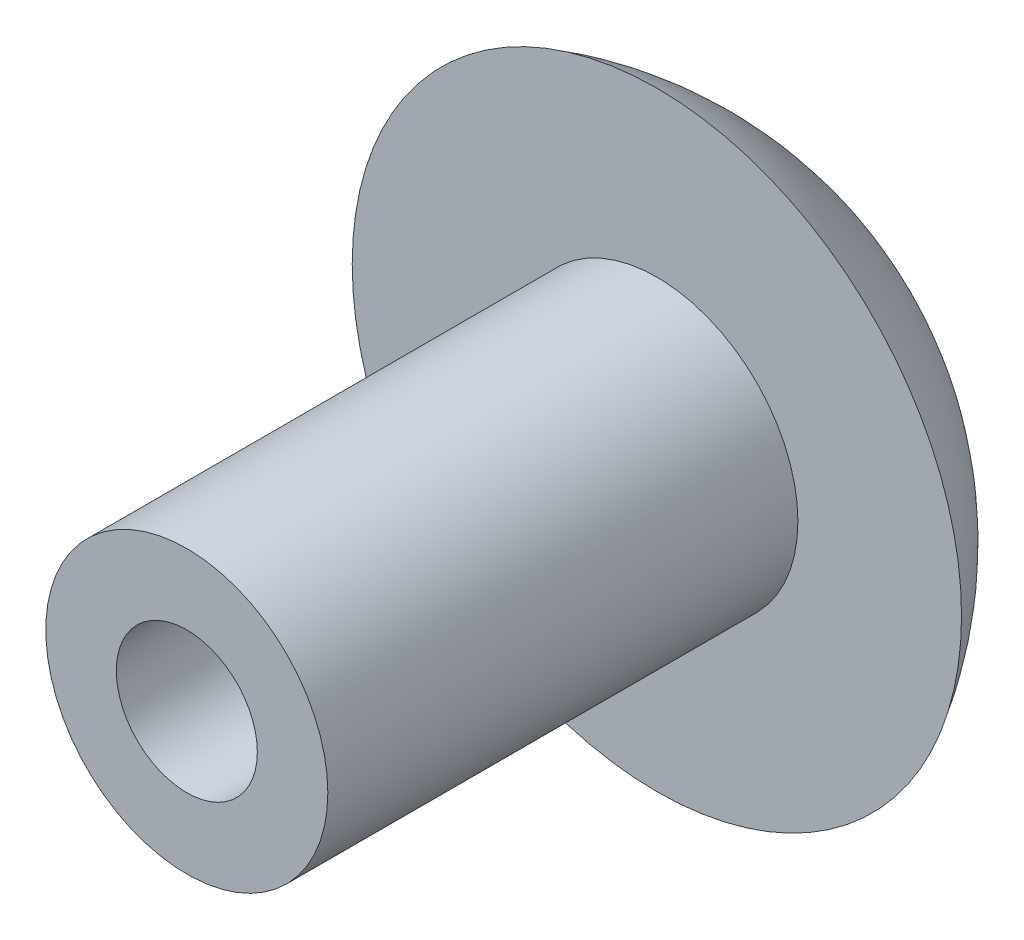
ISO-10303-21;
HEADER;
FILE_DESCRIPTION(('STEP AP214'),'2;1');
FILE_NAME('part.step','',(''),(''),'','','');
FILE_SCHEMA(('AUTOMOTIVE_DESIGN { 1 0 10303 214 1 1 1 1 }'));
ENDSEC;
DATA;
#1=APPLICATION_CONTEXT('core data for automotive mechanical design processes');
#2=APPLICATION_PROTOCOL_DEFINITION('international standard','automotive_design',2000,#1);
#3=PRODUCT_CONTEXT('',#1,'mechanical');
#4=PRODUCT('Part','Part','',(#3));
#5=PRODUCT_RELATED_PRODUCT_CATEGORY('part','',(#4));
#6=PRODUCT_DEFINITION_FORMATION('','',#4);
#7=PRODUCT_DEFINITION_CONTEXT('part definition',#1,'design');
#8=PRODUCT_DEFINITION('design','',#6,#7);
#9=PRODUCT_DEFINITION_SHAPE('','',#8);
#10=(LENGTH_UNIT() NAMED_UNIT(*) SI_UNIT(.MILLI.,.METRE.));
#11=(NAMED_UNIT(*) PLANE_ANGLE_UNIT() SI_UNIT($,.RADIAN.));
#12=(NAMED_UNIT(*) SI_UNIT($,.STERADIAN.) SOLID_ANGLE_UNIT());
#13=UNCERTAINTY_MEASURE_WITH_UNIT(LENGTH_MEASURE(1.E-05),#10,'distance_accuracy_value','');
#14=(GEOMETRIC_REPRESENTATION_CONTEXT(3) GLOBAL_UNCERTAINTY_ASSIGNED_CONTEXT((#13)) GLOBAL_UNIT_ASSIGNED_CONTEXT((#10,
#11,#12)) REPRESENTATION_CONTEXT('',''));
#15=CARTESIAN_POINT('',(0.,0.,0.));
#16=DIRECTION('',(0.,0.,1.));
#17=DIRECTION('',(1.,0.,0.));
#18=AXIS2_PLACEMENT_3D('',#15,#16,#17);
#19=CARTESIAN_POINT('',(0.,0.,0.));
#20=DIRECTION('',(-1.,0.,0.));
#21=DIRECTION('',(0.,0.,1.));
#22=AXIS2_PLACEMENT_3D('',#19,#20,#21);
#23=SPHERICAL_SURFACE('',#22,7.5);
#24=CARTESIAN_POINT('',(0.,0.,0.));
#25=DIRECTION('',(0.,0.,1.));
#26=DIRECTION('',(1.,0.,0.));
#27=AXIS2_PLACEMENT_3D('',#24,#25,#26);
#28=SPHERICAL_SURFACE('',#27,7.5);
#29=CARTESIAN_POINT('',(0.,0.,-3.77402765209939));
#30=DIRECTION('',(0.,0.,1.));
#31=DIRECTION('',(1.,0.,0.));
#32=AXIS2_PLACEMENT_3D('',#29,#30,#31);
#33=CIRCLE('',#32,6.48125877289198);
#34=CARTESIAN_POINT('',(6.48125877289198,0.,-3.77402765209939));
#35=VERTEX_POINT('',#34);
#36=EDGE_CURVE('E10',#35,#35,#33,.T.);
#37=ORIENTED_EDGE('',*,*,#36,.F.);
#38=EDGE_LOOP('',(#37));
#39=FACE_BOUND('',#38,.T.);
#40=ADVANCED_FACE('F37',(#39),#28,.T.);
#41=CARTESIAN_POINT('',(-9.04385894679914,-7.5,-3.77402765209939));
#42=DIRECTION('',(0.,0.,1.));
#43=DIRECTION('',(1.,0.,0.));
#44=AXIS2_PLACEMENT_3D('',#41,#42,#43);
#45=PLANE('',#44);
#46=CARTESIAN_POINT('',(0.,0.,-3.77402765209939));
#47=DIRECTION('',(0.,0.,1.));
#48=DIRECTION('',(1.,0.,0.));
#49=AXIS2_PLACEMENT_3D('',#46,#47,#48);
#50=CIRCLE('',#49,3.);
#51=CARTESIAN_POINT('',(3.,0.,-3.77402765209939));
#52=VERTEX_POINT('',#51);
#53=EDGE_CURVE('E49',#52,#52,#50,.T.);
#54=ORIENTED_EDGE('',*,*,#53,.F.);
#55=EDGE_LOOP('',(#54));
#56=FACE_BOUND('',#55,.T.);
#57=ORIENTED_EDGE('',*,*,#36,.T.);
#58=EDGE_LOOP('',(#57));
#59=FACE_BOUND('',#58,.T.);
#60=ADVANCED_FACE('F80',(#56,#59),#45,.T.);
#61=CARTESIAN_POINT('',(0.,0.,6.22597234790061));
#62=DIRECTION('',(0.,0.,-1.));
#63=DIRECTION('',(-1.,0.,0.));
#64=AXIS2_PLACEMENT_3D('',#61,#62,#63);
#65=CYLINDRICAL_SURFACE('',#64,3.);
#66=CARTESIAN_POINT('',(0.,0.,6.22597234790061));
#67=DIRECTION('',(0.,0.,1.));
#68=DIRECTION('',(1.,0.,0.));
#69=AXIS2_PLACEMENT_3D('',#66,#67,#68);
#70=CIRCLE('',#69,3.);
#71=CARTESIAN_POINT('',(3.,0.,6.22597234790061));
#72=VERTEX_POINT('',#71);
#73=EDGE_CURVE('E44',#72,#72,#70,.T.);
#74=ORIENTED_EDGE('',*,*,#73,.F.);
#75=EDGE_LOOP('',(#74));
#76=FACE_BOUND('',#75,.T.);
#77=ORIENTED_EDGE('',*,*,#53,.T.);
#78=EDGE_LOOP('',(#77));
#79=FACE_BOUND('',#78,.T.);
#80=ADVANCED_FACE('F75',(#76,#79),#65,.T.);
#81=CARTESIAN_POINT('',(0.,0.,6.22597234790061));
#82=DIRECTION('',(0.,0.,1.));
#83=DIRECTION('',(1.,0.,0.));
#84=AXIS2_PLACEMENT_3D('',#81,#82,#83);
#85=PLANE('',#84);
#86=CARTESIAN_POINT('',(0.,0.,6.22597234790061));
#87=DIRECTION('',(0.,0.,1.));
#88=DIRECTION('',(1.,0.,0.));
#89=AXIS2_PLACEMENT_3D('',#86,#87,#88);
#90=CIRCLE('',#89,1.5);
#91=CARTESIAN_POINT('',(1.5,0.,6.22597234790061));
#92=VERTEX_POINT('',#91);
#93=EDGE_CURVE('E57',#92,#92,#90,.T.);
#94=ORIENTED_EDGE('',*,*,#93,.F.);
#95=EDGE_LOOP('',(#94));
#96=FACE_BOUND('',#95,.T.);
#97=ORIENTED_EDGE('',*,*,#73,.T.);
#98=EDGE_LOOP('',(#97));
#99=FACE_BOUND('',#98,.T.);
#100=ADVANCED_FACE('F70',(#96,#99),#85,.T.);
#101=CARTESIAN_POINT('',(0.,0.,-3.77402765209939));
#102=DIRECTION('',(0.,0.,1.));
#103=DIRECTION('',(1.,0.,0.));
#104=AXIS2_PLACEMENT_3D('',#101,#102,#103);
#105=CYLINDRICAL_SURFACE('',#104,1.5);
#106=CARTESIAN_POINT('',(0.,0.,-3.77402765209939));
#107=DIRECTION('',(0.,0.,1.));
#108=DIRECTION('',(1.,0.,0.));
#109=AXIS2_PLACEMENT_3D('',#106,#107,#108);
#110=CIRCLE('',#109,1.5);
#111=CARTESIAN_POINT('',(1.5,0.,-3.77402765209939));
#112=VERTEX_POINT('',#111);
#113=EDGE_CURVE('E55',#112,#112,#110,.T.);
#114=ORIENTED_EDGE('',*,*,#113,.F.);
#115=EDGE_LOOP('',(#114));
#116=FACE_BOUND('',#115,.T.);
#117=ORIENTED_EDGE('',*,*,#93,.T.);
#118=EDGE_LOOP('',(#117));
#119=FACE_BOUND('',#118,.T.);
#120=ADVANCED_FACE('F67',(#116,#119),#105,.F.);
#121=CARTESIAN_POINT('',(0.,0.,-3.77402765209939));
#122=DIRECTION('',(0.,0.,1.));
#123=DIRECTION('',(1.,0.,0.));
#124=AXIS2_PLACEMENT_3D('',#121,#122,#123);
#125=PLANE('',#124);
#126=ORIENTED_EDGE('',*,*,#113,.T.);
#127=EDGE_LOOP('',(#126));
#128=FACE_BOUND('',#127,.T.);
#129=ADVANCED_FACE('F65',(#128),#125,.T.);
#130=CLOSED_SHELL('',(#40,#60,#80,#100,#120,#129));
#131=MANIFOLD_SOLID_BREP('B2',#130);
#132=ADVANCED_BREP_SHAPE_REPRESENTATION('',(#18,#131),#14);
#133=SHAPE_DEFINITION_REPRESENTATION(#9,#132);
ENDSEC;
END-ISO-10303-21;
